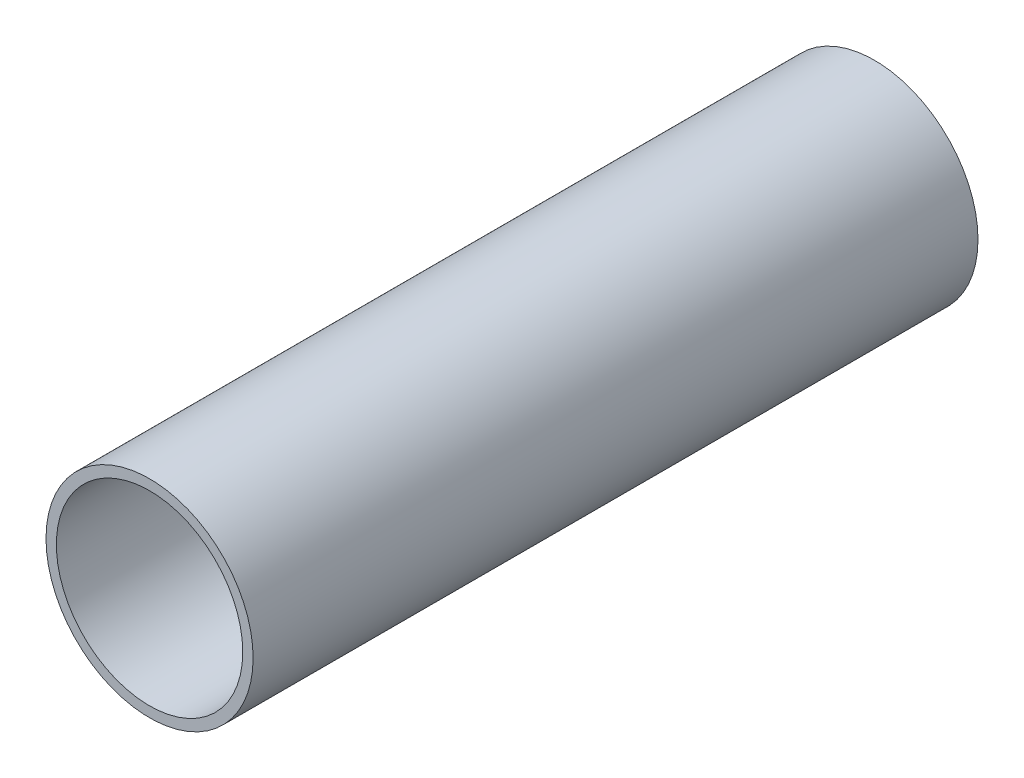
ISO-10303-21;
HEADER;
FILE_DESCRIPTION(('STEP AP214'),'2;1');
FILE_NAME('part.step','',(''),(''),'','','');
FILE_SCHEMA(('AUTOMOTIVE_DESIGN { 1 0 10303 214 1 1 1 1 }'));
ENDSEC;
DATA;
#1=APPLICATION_CONTEXT('core data for automotive mechanical design processes');
#2=APPLICATION_PROTOCOL_DEFINITION('international standard','automotive_design',2000,#1);
#3=PRODUCT_CONTEXT('',#1,'mechanical');
#4=PRODUCT('Part','Part','',(#3));
#5=PRODUCT_RELATED_PRODUCT_CATEGORY('part','',(#4));
#6=PRODUCT_DEFINITION_FORMATION('','',#4);
#7=PRODUCT_DEFINITION_CONTEXT('part definition',#1,'design');
#8=PRODUCT_DEFINITION('design','',#6,#7);
#9=PRODUCT_DEFINITION_SHAPE('','',#8);
#10=(LENGTH_UNIT() NAMED_UNIT(*) SI_UNIT(.MILLI.,.METRE.));
#11=(NAMED_UNIT(*) PLANE_ANGLE_UNIT() SI_UNIT($,.RADIAN.));
#12=(NAMED_UNIT(*) SI_UNIT($,.STERADIAN.) SOLID_ANGLE_UNIT());
#13=UNCERTAINTY_MEASURE_WITH_UNIT(LENGTH_MEASURE(1.E-05),#10,'distance_accuracy_value','');
#14=(GEOMETRIC_REPRESENTATION_CONTEXT(3) GLOBAL_UNCERTAINTY_ASSIGNED_CONTEXT((#13)) GLOBAL_UNIT_ASSIGNED_CONTEXT((#10,
#11,#12)) REPRESENTATION_CONTEXT('',''));
#15=CARTESIAN_POINT('',(0.,0.,0.));
#16=DIRECTION('',(0.,0.,1.));
#17=DIRECTION('',(1.,0.,0.));
#18=AXIS2_PLACEMENT_3D('',#15,#16,#17);
#19=CARTESIAN_POINT('',(0.,0.,14.));
#20=DIRECTION('',(0.,0.,1.));
#21=DIRECTION('',(1.,0.,0.));
#22=AXIS2_PLACEMENT_3D('',#19,#20,#21);
#23=PLANE('',#22);
#24=CARTESIAN_POINT('',(0.,0.,14.));
#25=DIRECTION('',(0.,0.,1.));
#26=DIRECTION('',(1.,0.,0.));
#27=AXIS2_PLACEMENT_3D('',#24,#25,#26);
#28=CIRCLE('',#27,2.);
#29=CARTESIAN_POINT('',(2.,0.,14.));
#30=VERTEX_POINT('',#29);
#31=EDGE_CURVE('E10',#30,#30,#28,.T.);
#32=ORIENTED_EDGE('',*,*,#31,.T.);
#33=EDGE_LOOP('',(#32));
#34=FACE_BOUND('',#33,.T.);
#35=CARTESIAN_POINT('',(0.,0.,14.));
#36=DIRECTION('',(0.,0.,1.));
#37=DIRECTION('',(1.,0.,0.));
#38=AXIS2_PLACEMENT_3D('',#35,#36,#37);
#39=CIRCLE('',#38,1.8);
#40=CARTESIAN_POINT('',(1.8,0.,14.));
#41=VERTEX_POINT('',#40);
#42=EDGE_CURVE('E45',#41,#41,#39,.T.);
#43=ORIENTED_EDGE('',*,*,#42,.F.);
#44=EDGE_LOOP('',(#43));
#45=FACE_BOUND('',#44,.T.);
#46=ADVANCED_FACE('F34',(#34,#45),#23,.T.);
#47=CARTESIAN_POINT('',(0.,0.,0.));
#48=DIRECTION('',(0.,0.,1.));
#49=DIRECTION('',(1.,0.,0.));
#50=AXIS2_PLACEMENT_3D('',#47,#48,#49);
#51=PLANE('',#50);
#52=CARTESIAN_POINT('',(0.,0.,0.));
#53=DIRECTION('',(0.,0.,1.));
#54=DIRECTION('',(1.,0.,0.));
#55=AXIS2_PLACEMENT_3D('',#52,#53,#54);
#56=CIRCLE('',#55,2.);
#57=CARTESIAN_POINT('',(2.,0.,0.));
#58=VERTEX_POINT('',#57);
#59=EDGE_CURVE('E38',#58,#58,#56,.T.);
#60=ORIENTED_EDGE('',*,*,#59,.F.);
#61=EDGE_LOOP('',(#60));
#62=FACE_BOUND('',#61,.T.);
#63=CARTESIAN_POINT('',(0.,0.,0.));
#64=DIRECTION('',(0.,0.,1.));
#65=DIRECTION('',(1.,0.,0.));
#66=AXIS2_PLACEMENT_3D('',#63,#64,#65);
#67=CIRCLE('',#66,1.8);
#68=CARTESIAN_POINT('',(1.8,0.,0.));
#69=VERTEX_POINT('',#68);
#70=EDGE_CURVE('E47',#69,#69,#67,.T.);
#71=ORIENTED_EDGE('',*,*,#70,.T.);
#72=EDGE_LOOP('',(#71));
#73=FACE_BOUND('',#72,.T.);
#74=ADVANCED_FACE('F57',(#62,#73),#51,.F.);
#75=CARTESIAN_POINT('',(0.,0.,14.));
#76=DIRECTION('',(0.,0.,-1.));
#77=DIRECTION('',(-1.,0.,0.));
#78=AXIS2_PLACEMENT_3D('',#75,#76,#77);
#79=CYLINDRICAL_SURFACE('',#78,2.);
#80=ORIENTED_EDGE('',*,*,#31,.F.);
#81=EDGE_LOOP('',(#80));
#82=FACE_BOUND('',#81,.T.);
#83=ORIENTED_EDGE('',*,*,#59,.T.);
#84=EDGE_LOOP('',(#83));
#85=FACE_BOUND('',#84,.T.);
#86=ADVANCED_FACE('F36',(#82,#85),#79,.T.);
#87=CARTESIAN_POINT('',(0.,0.,14.));
#88=DIRECTION('',(0.,0.,-1.));
#89=DIRECTION('',(-1.,0.,0.));
#90=AXIS2_PLACEMENT_3D('',#87,#88,#89);
#91=CYLINDRICAL_SURFACE('',#90,1.8);
#92=ORIENTED_EDGE('',*,*,#42,.T.);
#93=EDGE_LOOP('',(#92));
#94=FACE_BOUND('',#93,.T.);
#95=ORIENTED_EDGE('',*,*,#70,.F.);
#96=EDGE_LOOP('',(#95));
#97=FACE_BOUND('',#96,.T.);
#98=ADVANCED_FACE('F53',(#94,#97),#91,.F.);
#99=CLOSED_SHELL('',(#46,#74,#86,#98));
#100=MANIFOLD_SOLID_BREP('B2',#99);
#101=ADVANCED_BREP_SHAPE_REPRESENTATION('',(#18,#100),#14);
#102=SHAPE_DEFINITION_REPRESENTATION(#9,#101);
ENDSEC;
END-ISO-10303-21;
